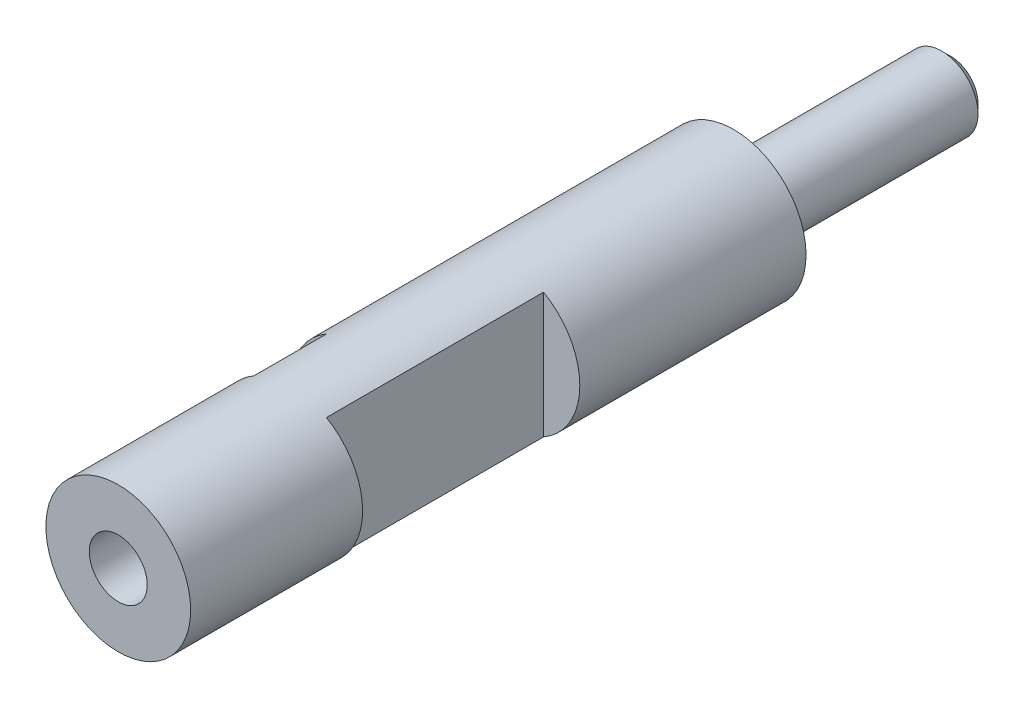
ISO-10303-21;
HEADER;
FILE_DESCRIPTION(('STEP AP214'),'2;1');
FILE_NAME('part.step','',(''),(''),'','','');
FILE_SCHEMA(('AUTOMOTIVE_DESIGN { 1 0 10303 214 1 1 1 1 }'));
ENDSEC;
DATA;
#1=APPLICATION_CONTEXT('core data for automotive mechanical design processes');
#2=APPLICATION_PROTOCOL_DEFINITION('international standard','automotive_design',2000,#1);
#3=PRODUCT_CONTEXT('',#1,'mechanical');
#4=PRODUCT('Part','Part','',(#3));
#5=PRODUCT_RELATED_PRODUCT_CATEGORY('part','',(#4));
#6=PRODUCT_DEFINITION_FORMATION('','',#4);
#7=PRODUCT_DEFINITION_CONTEXT('part definition',#1,'design');
#8=PRODUCT_DEFINITION('design','',#6,#7);
#9=PRODUCT_DEFINITION_SHAPE('','',#8);
#10=(LENGTH_UNIT() NAMED_UNIT(*) SI_UNIT(.MILLI.,.METRE.));
#11=(NAMED_UNIT(*) PLANE_ANGLE_UNIT() SI_UNIT($,.RADIAN.));
#12=(NAMED_UNIT(*) SI_UNIT($,.STERADIAN.) SOLID_ANGLE_UNIT());
#13=UNCERTAINTY_MEASURE_WITH_UNIT(LENGTH_MEASURE(1.E-05),#10,'distance_accuracy_value','');
#14=(GEOMETRIC_REPRESENTATION_CONTEXT(3) GLOBAL_UNCERTAINTY_ASSIGNED_CONTEXT((#13)) GLOBAL_UNIT_ASSIGNED_CONTEXT((#10,
#11,#12)) REPRESENTATION_CONTEXT('',''));
#15=CARTESIAN_POINT('',(0.,0.,0.));
#16=DIRECTION('',(0.,0.,1.));
#17=DIRECTION('',(1.,0.,0.));
#18=AXIS2_PLACEMENT_3D('',#15,#16,#17);
#19=CARTESIAN_POINT('',(0.,0.,12.));
#20=DIRECTION('',(0.,0.,-1.));
#21=DIRECTION('',(-1.,0.,0.));
#22=AXIS2_PLACEMENT_3D('',#19,#20,#21);
#23=CYLINDRICAL_SURFACE('',#22,2.);
#24=CARTESIAN_POINT('',(0.,0.,0.499999999999999));
#25=DIRECTION('',(0.,0.,1.));
#26=DIRECTION('',(1.,0.,0.));
#27=AXIS2_PLACEMENT_3D('',#24,#25,#26);
#28=CIRCLE('',#27,2.);
#29=CARTESIAN_POINT('',(2.,0.,0.499999999999999));
#30=VERTEX_POINT('',#29);
#31=EDGE_CURVE('E137',#30,#30,#28,.T.);
#32=ORIENTED_EDGE('',*,*,#31,.T.);
#33=EDGE_LOOP('',(#32));
#34=FACE_BOUND('',#33,.T.);
#35=CARTESIAN_POINT('',(0.,0.,12.));
#36=DIRECTION('',(0.,0.,1.));
#37=DIRECTION('',(1.,0.,0.));
#38=AXIS2_PLACEMENT_3D('',#35,#36,#37);
#39=CIRCLE('',#38,2.);
#40=CARTESIAN_POINT('',(2.,0.,12.));
#41=VERTEX_POINT('',#40);
#42=EDGE_CURVE('E141',#41,#41,#39,.T.);
#43=ORIENTED_EDGE('',*,*,#42,.F.);
#44=EDGE_LOOP('',(#43));
#45=FACE_BOUND('',#44,.T.);
#46=ADVANCED_FACE('F49',(#34,#45),#23,.T.);
#47=CARTESIAN_POINT('',(0.,0.,0.));
#48=DIRECTION('',(0.,0.,1.));
#49=DIRECTION('',(1.,0.,0.));
#50=AXIS2_PLACEMENT_3D('',#47,#48,#49);
#51=PLANE('',#50);
#52=CARTESIAN_POINT('',(0.,0.,0.));
#53=DIRECTION('',(0.,0.,1.));
#54=DIRECTION('',(1.,0.,0.));
#55=AXIS2_PLACEMENT_3D('',#52,#53,#54);
#56=CIRCLE('',#55,1.5);
#57=CARTESIAN_POINT('',(1.5,0.,0.));
#58=VERTEX_POINT('',#57);
#59=EDGE_CURVE('E133',#58,#58,#56,.F.);
#60=ORIENTED_EDGE('',*,*,#59,.T.);
#61=EDGE_LOOP('',(#60));
#62=FACE_BOUND('',#61,.T.);
#63=ADVANCED_FACE('F195',(#62),#51,.F.);
#64=CARTESIAN_POINT('',(0.,0.,0.499999999999999));
#65=DIRECTION('',(0.,0.,1.));
#66=DIRECTION('',(1.,0.,0.));
#67=AXIS2_PLACEMENT_3D('',#64,#65,#66);
#68=CONICAL_SURFACE('',#67,2.,0.78539816339745);
#69=ORIENTED_EDGE('',*,*,#59,.F.);
#70=EDGE_LOOP('',(#69));
#71=FACE_BOUND('',#70,.T.);
#72=ORIENTED_EDGE('',*,*,#31,.F.);
#73=EDGE_LOOP('',(#72));
#74=FACE_BOUND('',#73,.T.);
#75=ADVANCED_FACE('F52',(#71,#74),#68,.T.);
#76=CARTESIAN_POINT('',(0.,0.,46.));
#77=DIRECTION('',(0.,0.,-1.));
#78=DIRECTION('',(-1.,0.,0.));
#79=AXIS2_PLACEMENT_3D('',#76,#77,#78);
#80=CYLINDRICAL_SURFACE('',#79,4.);
#81=CARTESIAN_POINT('',(0.,0.,32.5));
#82=DIRECTION('',(0.,0.,-1.));
#83=DIRECTION('',(-1.,0.,0.));
#84=AXIS2_PLACEMENT_3D('',#81,#82,#83);
#85=CIRCLE('',#84,4.);
#86=CARTESIAN_POINT('',(-2.,-3.46410161513776,32.5));
#87=VERTEX_POINT('',#86);
#88=CARTESIAN_POINT('',(-2.,3.46410161513776,32.5));
#89=VERTEX_POINT('',#88);
#90=EDGE_CURVE('E11',#87,#89,#85,.T.);
#91=ORIENTED_EDGE('',*,*,#90,.T.);
#92=DIRECTION('',(0.,0.,-1.));
#93=VECTOR('',#92,1.);
#94=CARTESIAN_POINT('',(-2.,3.46410161513776,46.));
#95=LINE('',#94,#93);
#96=CARTESIAN_POINT('',(-2.,3.46410161513776,36.5));
#97=VERTEX_POINT('',#96);
#98=EDGE_CURVE('E101',#89,#97,#95,.F.);
#99=ORIENTED_EDGE('',*,*,#98,.T.);
#100=CARTESIAN_POINT('',(0.,0.,36.5));
#101=DIRECTION('',(0.,0.,1.));
#102=DIRECTION('',(1.,0.,0.));
#103=AXIS2_PLACEMENT_3D('',#100,#101,#102);
#104=CIRCLE('',#103,4.);
#105=CARTESIAN_POINT('',(-2.,-3.46410161513776,36.5));
#106=VERTEX_POINT('',#105);
#107=EDGE_CURVE('E95',#97,#106,#104,.T.);
#108=ORIENTED_EDGE('',*,*,#107,.T.);
#109=DIRECTION('',(0.,0.,-1.));
#110=VECTOR('',#109,1.);
#111=CARTESIAN_POINT('',(-2.,-3.46410161513776,46.));
#112=LINE('',#111,#110);
#113=EDGE_CURVE('E65',#106,#87,#112,.T.);
#114=ORIENTED_EDGE('',*,*,#113,.T.);
#115=EDGE_LOOP('',(#91,#99,#108,#114));
#116=FACE_BOUND('',#115,.T.);
#117=CARTESIAN_POINT('',(0.,0.,36.5));
#118=DIRECTION('',(0.,0.,1.));
#119=DIRECTION('',(1.,0.,0.));
#120=AXIS2_PLACEMENT_3D('',#117,#118,#119);
#121=CIRCLE('',#120,4.);
#122=CARTESIAN_POINT('',(2.,-3.46410161513775,36.5));
#123=VERTEX_POINT('',#122);
#124=CARTESIAN_POINT('',(2.,3.46410161513775,36.5));
#125=VERTEX_POINT('',#124);
#126=EDGE_CURVE('E102',#123,#125,#121,.T.);
#127=ORIENTED_EDGE('',*,*,#126,.T.);
#128=DIRECTION('',(0.,0.,-1.));
#129=VECTOR('',#128,1.);
#130=CARTESIAN_POINT('',(2.,3.46410161513775,46.));
#131=LINE('',#130,#129);
#132=CARTESIAN_POINT('',(2.,3.46410161513775,24.5));
#133=VERTEX_POINT('',#132);
#134=EDGE_CURVE('E121',#125,#133,#131,.T.);
#135=ORIENTED_EDGE('',*,*,#134,.T.);
#136=CARTESIAN_POINT('',(0.,0.,24.5));
#137=DIRECTION('',(0.,0.,-1.));
#138=DIRECTION('',(-1.,0.,0.));
#139=AXIS2_PLACEMENT_3D('',#136,#137,#138);
#140=CIRCLE('',#139,4.);
#141=CARTESIAN_POINT('',(2.,-3.46410161513775,24.5));
#142=VERTEX_POINT('',#141);
#143=EDGE_CURVE('E129',#133,#142,#140,.T.);
#144=ORIENTED_EDGE('',*,*,#143,.T.);
#145=DIRECTION('',(0.,0.,-1.));
#146=VECTOR('',#145,1.);
#147=CARTESIAN_POINT('',(2.,-3.46410161513775,46.));
#148=LINE('',#147,#146);
#149=EDGE_CURVE('E125',#142,#123,#148,.F.);
#150=ORIENTED_EDGE('',*,*,#149,.T.);
#151=EDGE_LOOP('',(#127,#135,#144,#150));
#152=FACE_BOUND('',#151,.T.);
#153=CARTESIAN_POINT('',(0.,0.,46.));
#154=DIRECTION('',(0.,0.,1.));
#155=DIRECTION('',(1.,0.,0.));
#156=AXIS2_PLACEMENT_3D('',#153,#154,#155);
#157=CIRCLE('',#156,4.);
#158=CARTESIAN_POINT('',(4.,0.,46.));
#159=VERTEX_POINT('',#158);
#160=EDGE_CURVE('E145',#159,#159,#157,.T.);
#161=ORIENTED_EDGE('',*,*,#160,.F.);
#162=EDGE_LOOP('',(#161));
#163=FACE_BOUND('',#162,.T.);
#164=CARTESIAN_POINT('',(0.,0.,12.));
#165=DIRECTION('',(0.,0.,1.));
#166=DIRECTION('',(1.,0.,0.));
#167=AXIS2_PLACEMENT_3D('',#164,#165,#166);
#168=CIRCLE('',#167,4.);
#169=CARTESIAN_POINT('',(4.,0.,12.));
#170=VERTEX_POINT('',#169);
#171=EDGE_CURVE('E146',#170,#170,#168,.T.);
#172=ORIENTED_EDGE('',*,*,#171,.T.);
#173=EDGE_LOOP('',(#172));
#174=FACE_BOUND('',#173,.T.);
#175=ADVANCED_FACE('F112',(#116,#152,#163,#174),#80,.T.);
#176=CARTESIAN_POINT('',(0.,0.,46.));
#177=DIRECTION('',(0.,0.,1.));
#178=DIRECTION('',(1.,0.,0.));
#179=AXIS2_PLACEMENT_3D('',#176,#177,#178);
#180=PLANE('',#179);
#181=CARTESIAN_POINT('',(0.,0.,46.));
#182=DIRECTION('',(0.,0.,1.));
#183=DIRECTION('',(1.,0.,0.));
#184=AXIS2_PLACEMENT_3D('',#181,#182,#183);
#185=CIRCLE('',#184,1.6);
#186=CARTESIAN_POINT('',(1.6,0.,46.));
#187=VERTEX_POINT('',#186);
#188=EDGE_CURVE('E154',#187,#187,#185,.T.);
#189=ORIENTED_EDGE('',*,*,#188,.F.);
#190=EDGE_LOOP('',(#189));
#191=FACE_BOUND('',#190,.T.);
#192=ORIENTED_EDGE('',*,*,#160,.T.);
#193=EDGE_LOOP('',(#192));
#194=FACE_BOUND('',#193,.T.);
#195=ADVANCED_FACE('F206',(#191,#194),#180,.T.);
#196=CARTESIAN_POINT('',(0.,0.,12.));
#197=DIRECTION('',(0.,0.,1.));
#198=DIRECTION('',(1.,0.,0.));
#199=AXIS2_PLACEMENT_3D('',#196,#197,#198);
#200=PLANE('',#199);
#201=ORIENTED_EDGE('',*,*,#42,.T.);
#202=EDGE_LOOP('',(#201));
#203=FACE_BOUND('',#202,.T.);
#204=ORIENTED_EDGE('',*,*,#171,.F.);
#205=EDGE_LOOP('',(#204));
#206=FACE_BOUND('',#205,.T.);
#207=ADVANCED_FACE('F207',(#203,#206),#200,.F.);
#208=CARTESIAN_POINT('',(0.,0.,32.));
#209=DIRECTION('',(0.,0.,1.));
#210=DIRECTION('',(1.,0.,0.));
#211=AXIS2_PLACEMENT_3D('',#208,#209,#210);
#212=CYLINDRICAL_SURFACE('',#211,1.6);
#213=CARTESIAN_POINT('',(-1.59992335562792,-0.01566065504026,35.8283589544012));
#214=CARTESIAN_POINT('',(-1.60051398641273,0.0446519743649532,35.8283592197506));
#215=CARTESIAN_POINT('',(-1.59766550649352,0.104997408818394,35.8239667157289));
#216=CARTESIAN_POINT('',(-1.58540080876899,0.223771259340163,35.8066823180663));
#217=CARTESIAN_POINT('',(-1.57598166030833,0.282198807810962,35.7937866319695));
#218=CARTESIAN_POINT('',(-1.55150084355407,0.395188253416264,35.760374184345));
#219=CARTESIAN_POINT('',(-1.53646918379697,0.449768905977262,35.7398979587068));
#220=CARTESIAN_POINT('',(-1.50190204246696,0.554372664157289,35.692301574983));
#221=CARTESIAN_POINT('',(-1.48236580191508,0.604394999759434,35.665180297221));
#222=CARTESIAN_POINT('',(-1.43807942581234,0.703665469680316,35.6024812798065));
#223=CARTESIAN_POINT('',(-1.41301610681427,0.752425931415431,35.5663575336208));
#224=CARTESIAN_POINT('',(-1.36056048199697,0.843591900012313,35.488192646947));
#225=CARTESIAN_POINT('',(-1.33316510016127,0.885988803170326,35.4461436415567));
#226=CARTESIAN_POINT('',(-1.27171375826338,0.972696519746002,35.3470471335981));
#227=CARTESIAN_POINT('',(-1.23749837307348,1.01543918038734,35.2887224688972));
#228=CARTESIAN_POINT('',(-1.17162156081411,1.09077571150146,35.1645057536111));
#229=CARTESIAN_POINT('',(-1.13995771784218,1.12337926776434,35.0986210079993));
#230=CARTESIAN_POINT('',(-1.09394875080726,1.1678719777496,34.9834799618983));
#231=CARTESIAN_POINT('',(-1.07740482521582,1.1830240111865,34.936375327916));
#232=CARTESIAN_POINT('',(-1.04953046256598,1.20782233997995,34.8392964223545));
#233=CARTESIAN_POINT('',(-1.03818785945617,1.2174814961937,34.7893291579999));
#234=CARTESIAN_POINT('',(-1.02249254412877,1.23070078602073,34.6868602910238));
#235=CARTESIAN_POINT('',(-1.01821983671318,1.23419114157047,34.6343365141266));
#236=CARTESIAN_POINT('',(-1.0178724951523,1.23447813883338,34.5292405314093));
#237=CARTESIAN_POINT('',(-1.02179716412174,1.23127534955226,34.4766683300855));
#238=CARTESIAN_POINT('',(-1.03593474676385,1.21938658790336,34.3803761031151));
#239=CARTESIAN_POINT('',(-1.04523727013323,1.21149053358207,34.3364119485059));
#240=CARTESIAN_POINT('',(-1.0680682721456,1.19141181547486,34.2506085122644));
#241=CARTESIAN_POINT('',(-1.08160163062656,1.17922419974784,34.2087717494777));
#242=CARTESIAN_POINT('',(-1.12134512401767,1.14180898464298,34.1010579231685));
#243=CARTESIAN_POINT('',(-1.15007117945429,1.1132581721954,34.0372685320052));
#244=CARTESIAN_POINT('',(-1.21079911095485,1.0469018998542,33.916366081359));
#245=CARTESIAN_POINT('',(-1.24280918524454,1.00907293405578,33.8592705321949));
#246=CARTESIAN_POINT('',(-1.30792562906444,0.92321984880614,33.7501191331051));
#247=CARTESIAN_POINT('',(-1.34103226652577,0.874892807051372,33.6983006557326));
#248=CARTESIAN_POINT('',(-1.40433331125403,0.769177712321846,33.6028682066918));
#249=CARTESIAN_POINT('',(-1.43453279318054,0.711805927139406,33.5592398072826));
#250=CARTESIAN_POINT('',(-1.48443376961649,0.599598449367478,33.4886249824086));
#251=CARTESIAN_POINT('',(-1.50504634687406,0.546169472223825,33.4600563389661));
#252=CARTESIAN_POINT('',(-1.54106786576418,0.434232594377977,33.4105260058673));
#253=CARTESIAN_POINT('',(-1.55647968280805,0.375727522730022,33.389560112301));
#254=CARTESIAN_POINT('',(-1.58084638241591,0.254498852970564,33.3562752203533));
#255=CARTESIAN_POINT('',(-1.58975375700925,0.191747803694553,33.3440198600465));
#256=CARTESIAN_POINT('',(-1.59996947812143,0.0645053856165514,33.3292929431087));
#257=CARTESIAN_POINT('',(-1.60128288424633,1.52043270332719E-05,33.3268148725476));
#258=CARTESIAN_POINT('',(-1.59645235525257,-0.120616556582351,33.3314865657478));
#259=CARTESIAN_POINT('',(-1.59117410203303,-0.176841440544743,33.3375296846597));
#260=CARTESIAN_POINT('',(-1.57500505300092,-0.287173169729356,33.356917624019));
#261=CARTESIAN_POINT('',(-1.56411335127823,-0.3412796715657,33.3702636230419));
#262=CARTESIAN_POINT('',(-1.53729548909393,-0.446923327601417,33.4037812300448));
#263=CARTESIAN_POINT('',(-1.52129649588839,-0.498409975418251,33.4240519006189));
#264=CARTESIAN_POINT('',(-1.48533008941169,-0.597124861083465,33.470487948946));
#265=CARTESIAN_POINT('',(-1.46536195190852,-0.644352319487041,33.4966544025926));
#266=CARTESIAN_POINT('',(-1.41902464365573,-0.74142502600735,33.5587485978625));
#267=CARTESIAN_POINT('',(-1.3921425790386,-0.790449978368748,33.595571450904));
#268=CARTESIAN_POINT('',(-1.33605044002321,-0.881962312254924,33.6751930082608));
#269=CARTESIAN_POINT('',(-1.30683650988296,-0.92443851070811,33.7180017018434));
#270=CARTESIAN_POINT('',(-1.24140710430547,-1.01116593234711,33.8188769753201));
#271=CARTESIAN_POINT('',(-1.20504692611013,-1.05380517512688,33.8782392950905));
#272=CARTESIAN_POINT('',(-1.13518283042602,-1.12869906068295,34.0047392236078));
#273=CARTESIAN_POINT('',(-1.10167504338259,-1.16096794242203,34.0718659975897));
#274=CARTESIAN_POINT('',(-1.05444112936122,-1.20364167444238,34.1867291285406));
#275=CARTESIAN_POINT('',(-1.03806068875805,-1.21768362131629,34.2320081938132));
#276=CARTESIAN_POINT('',(-1.0104203157203,-1.24071536408044,34.3252983445065));
#277=CARTESIAN_POINT('',(-0.999148237778241,-1.2497171554502,34.3733026411409));
#278=CARTESIAN_POINT('',(-0.983463102167712,-1.26210538745594,34.4717844666174));
#279=CARTESIAN_POINT('',(-0.979131367141739,-1.26542528142483,34.5222842714969));
#280=CARTESIAN_POINT('',(-0.978555168224698,-1.26587150660356,34.6233606962954));
#281=CARTESIAN_POINT('',(-0.982309836887773,-1.26299850213887,34.6739373073936));
#282=CARTESIAN_POINT('',(-0.996061571394137,-1.25216566064754,34.7666219007126));
#283=CARTESIAN_POINT('',(-1.00516089684863,-1.24493406982141,34.808960812758));
#284=CARTESIAN_POINT('',(-1.02755933198251,-1.2265125680985,34.8916214072142));
#285=CARTESIAN_POINT('',(-1.04086345229758,-1.21531793272578,34.9319406160963));
#286=CARTESIAN_POINT('',(-1.08067995517945,-1.18035096506175,35.0376091942421));
#287=CARTESIAN_POINT('',(-1.10993503032938,-1.15325054881688,35.1008159545432));
#288=CARTESIAN_POINT('',(-1.17200823137658,-1.09012526172874,35.2207259558639));
#289=CARTESIAN_POINT('',(-1.20483578592623,-1.05407643651562,35.2774111330086));
#290=CARTESIAN_POINT('',(-1.27218138116026,-0.971853214978283,35.3864712768895));
#291=CARTESIAN_POINT('',(-1.30671283592181,-0.925319296592899,35.4385679757748));
#292=CARTESIAN_POINT('',(-1.37325710705258,-0.823326215813891,35.5349596697424));
#293=CARTESIAN_POINT('',(-1.40527389407412,-0.767881563111055,35.57926710687));
#294=CARTESIAN_POINT('',(-1.45960439498907,-0.657804899215236,35.6525109937778));
#295=CARTESIAN_POINT('',(-1.48265211098081,-0.604420943860361,35.6827693297716));
#296=CARTESIAN_POINT('',(-1.5235992884539,-0.492143025567972,35.7356422123316));
#297=CARTESIAN_POINT('',(-1.54150275479068,-0.433253396459097,35.7582627074576));
#298=CARTESIAN_POINT('',(-1.56969474706029,-0.315391338701414,35.793338615078));
#299=CARTESIAN_POINT('',(-1.5804220662934,-0.256702770288071,35.806385806492));
#300=CARTESIAN_POINT('',(-1.59523677788673,-0.137240009122235,35.8238934371142));
#301=CARTESIAN_POINT('',(-1.59932788993347,-0.0764670042469674,35.8283586868797));
#302=CARTESIAN_POINT('',(-1.59992335562792,-0.01566065504026,35.8283589544012));
#303=B_SPLINE_CURVE_WITH_KNOTS('',3,(#213,#214,#215,#216,#217,#218,#219,#220,#221,#222,#223,
#224,#225,#226,#227,#228,#229,#230,#231,#232,#233,#234,#235,#236,#237,#238,#239,#240,#241,#242,
#243,#244,#245,#246,#247,#248,#249,#250,#251,#252,#253,#254,#255,#256,#257,#258,#259,#260,#261,
#262,#263,#264,#265,#266,#267,#268,#269,#270,#271,#272,#273,#274,#275,#276,#277,#278,#279,#280,
#281,#282,#283,#284,#285,#286,#287,#288,#289,#290,#291,#292,#293,#294,#295,#296,#297,#298,#299,
#300,#301,#302),.UNSPECIFIED.,.T.,.F.,(4,2,2,2,2,2,2,2,2,2,2,2,2,2,2,2,2,2,2,2,2,2,2,2,2,2,2,2,
2,2,2,2,2,2,2,2,2,2,2,2,2,2,2,2,4),(0.,0.180697664804613,0.361475976113659,0.541301243803317,
0.721156832507399,0.917433550919698,1.11397329556707,1.35300739255978,1.59181243607709,
1.74784560977227,1.90351193180966,2.0609280600016,2.21833080628809,2.35469962106323,
2.49122630733711,2.71666526199695,2.94268136805058,3.17638253655457,3.40966806949399,
3.60090602888267,3.79203808217807,3.98455255568754,4.17693874847701,4.34651559710191,
4.51611982096846,4.68825969671778,4.86043101094089,5.06056104031514,5.26102912692568,
5.50496266100496,5.74855981825055,5.89857806565769,6.04823773792538,6.19963853243931,
6.35102308667446,6.48225080894902,6.61363550186634,6.83660036682413,7.06016865692379,
7.29305882420956,7.52557353977493,7.72145779248962,7.91718913137501,8.09946819441388,
8.28164505215168),.UNSPECIFIED.);
#304=CARTESIAN_POINT('',(-1.59992335562792,-0.01566065504026,35.8283589544012));
#305=VERTEX_POINT('',#304);
#306=EDGE_CURVE('E54',#305,#305,#303,.T.);
#307=ORIENTED_EDGE('',*,*,#306,.T.);
#308=EDGE_LOOP('',(#307));
#309=FACE_BOUND('',#308,.T.);
#310=CARTESIAN_POINT('',(0.,0.,32.));
#311=DIRECTION('',(0.,0.,1.));
#312=DIRECTION('',(1.,0.,0.));
#313=AXIS2_PLACEMENT_3D('',#310,#311,#312);
#314=CIRCLE('',#313,1.6);
#315=CARTESIAN_POINT('',(1.6,0.,32.));
#316=VERTEX_POINT('',#315);
#317=EDGE_CURVE('E150',#316,#316,#314,.T.);
#318=ORIENTED_EDGE('',*,*,#317,.F.);
#319=EDGE_LOOP('',(#318));
#320=FACE_BOUND('',#319,.T.);
#321=ORIENTED_EDGE('',*,*,#188,.T.);
#322=EDGE_LOOP('',(#321));
#323=FACE_BOUND('',#322,.T.);
#324=ADVANCED_FACE('F210',(#309,#320,#323),#212,.F.);
#325=CARTESIAN_POINT('',(0.,0.,32.));
#326=DIRECTION('',(0.,0.,1.));
#327=DIRECTION('',(1.,0.,0.));
#328=AXIS2_PLACEMENT_3D('',#325,#326,#327);
#329=PLANE('',#328);
#330=CARTESIAN_POINT('',(0.,0.,32.));
#331=VERTEX_POINT('',#330);
#332=VERTEX_LOOP('',#331);
#333=FACE_BOUND('',#332,.T.);
#334=ORIENTED_EDGE('',*,*,#317,.T.);
#335=EDGE_LOOP('',(#334));
#336=FACE_BOUND('',#335,.T.);
#337=ADVANCED_FACE('F217',(#333,#336),#329,.T.);
#338=CARTESIAN_POINT('',(4.,-4.,36.5));
#339=DIRECTION('',(0.,0.,1.));
#340=DIRECTION('',(1.,0.,0.));
#341=AXIS2_PLACEMENT_3D('',#338,#339,#340);
#342=PLANE('',#341);
#343=ORIENTED_EDGE('',*,*,#126,.F.);
#344=DIRECTION('',(0.,1.,0.));
#345=VECTOR('',#344,1.);
#346=CARTESIAN_POINT('',(2.,-4.,36.5));
#347=LINE('',#346,#345);
#348=EDGE_CURVE('E158',#123,#125,#347,.T.);
#349=ORIENTED_EDGE('',*,*,#348,.T.);
#350=EDGE_LOOP('',(#343,#349));
#351=FACE_BOUND('',#350,.T.);
#352=ADVANCED_FACE('F221',(#351),#342,.F.);
#353=CARTESIAN_POINT('',(2.,-4.,24.5));
#354=DIRECTION('',(-1.,0.,0.));
#355=DIRECTION('',(0.,0.,1.));
#356=AXIS2_PLACEMENT_3D('',#353,#354,#355);
#357=PLANE('',#356);
#358=ORIENTED_EDGE('',*,*,#348,.F.);
#359=ORIENTED_EDGE('',*,*,#149,.F.);
#360=DIRECTION('',(0.,1.,0.));
#361=VECTOR('',#360,1.);
#362=CARTESIAN_POINT('',(2.,-4.,24.5));
#363=LINE('',#362,#361);
#364=EDGE_CURVE('E162',#142,#133,#363,.T.);
#365=ORIENTED_EDGE('',*,*,#364,.T.);
#366=ORIENTED_EDGE('',*,*,#134,.F.);
#367=EDGE_LOOP('',(#358,#359,#365,#366));
#368=FACE_BOUND('',#367,.T.);
#369=ADVANCED_FACE('F224',(#368),#357,.F.);
#370=CARTESIAN_POINT('',(4.,-4.,24.5));
#371=DIRECTION('',(0.,0.,-1.));
#372=DIRECTION('',(-1.,0.,0.));
#373=AXIS2_PLACEMENT_3D('',#370,#371,#372);
#374=PLANE('',#373);
#375=ORIENTED_EDGE('',*,*,#364,.F.);
#376=ORIENTED_EDGE('',*,*,#143,.F.);
#377=EDGE_LOOP('',(#375,#376));
#378=FACE_BOUND('',#377,.T.);
#379=ADVANCED_FACE('F191',(#378),#374,.F.);
#380=CARTESIAN_POINT('',(-4.,-4.,32.5));
#381=DIRECTION('',(0.,0.,-1.));
#382=DIRECTION('',(-1.,0.,0.));
#383=AXIS2_PLACEMENT_3D('',#380,#381,#382);
#384=PLANE('',#383);
#385=ORIENTED_EDGE('',*,*,#90,.F.);
#386=DIRECTION('',(0.,1.,0.));
#387=VECTOR('',#386,1.);
#388=CARTESIAN_POINT('',(-2.,-4.,32.5));
#389=LINE('',#388,#387);
#390=EDGE_CURVE('E110',#87,#89,#389,.T.);
#391=ORIENTED_EDGE('',*,*,#390,.T.);
#392=EDGE_LOOP('',(#385,#391));
#393=FACE_BOUND('',#392,.T.);
#394=ADVANCED_FACE('F183',(#393),#384,.F.);
#395=CARTESIAN_POINT('',(-2.,-4.,32.5));
#396=DIRECTION('',(1.,0.,0.));
#397=DIRECTION('',(0.,0.,-1.));
#398=AXIS2_PLACEMENT_3D('',#395,#396,#397);
#399=PLANE('',#398);
#400=CARTESIAN_POINT('',(-2.,-0.01566065504026,34.5783589544012));
#401=DIRECTION('',(-1.,0.,0.));
#402=DIRECTION('',(0.,0.,1.));
#403=AXIS2_PLACEMENT_3D('',#400,#401,#402);
#404=CIRCLE('',#403,1.525);
#405=CARTESIAN_POINT('',(-2.,-0.01566065504026,36.1033589544012));
#406=VERTEX_POINT('',#405);
#407=EDGE_CURVE('E175',#406,#406,#404,.T.);
#408=ORIENTED_EDGE('',*,*,#407,.F.);
#409=EDGE_LOOP('',(#408));
#410=FACE_BOUND('',#409,.T.);
#411=DIRECTION('',(0.,1.,0.));
#412=VECTOR('',#411,1.);
#413=CARTESIAN_POINT('',(-2.,-4.,36.5));
#414=LINE('',#413,#412);
#415=EDGE_CURVE('E71',#106,#97,#414,.T.);
#416=ORIENTED_EDGE('',*,*,#415,.T.);
#417=ORIENTED_EDGE('',*,*,#98,.F.);
#418=ORIENTED_EDGE('',*,*,#390,.F.);
#419=ORIENTED_EDGE('',*,*,#113,.F.);
#420=EDGE_LOOP('',(#416,#417,#418,#419));
#421=FACE_BOUND('',#420,.T.);
#422=ADVANCED_FACE('F106',(#410,#421),#399,.F.);
#423=CARTESIAN_POINT('',(-4.,-4.,36.5));
#424=DIRECTION('',(0.,0.,1.));
#425=DIRECTION('',(1.,0.,0.));
#426=AXIS2_PLACEMENT_3D('',#423,#424,#425);
#427=PLANE('',#426);
#428=ORIENTED_EDGE('',*,*,#415,.F.);
#429=ORIENTED_EDGE('',*,*,#107,.F.);
#430=EDGE_LOOP('',(#428,#429));
#431=FACE_BOUND('',#430,.T.);
#432=ADVANCED_FACE('F96',(#431),#427,.F.);
#433=CARTESIAN_POINT('',(-2.,-0.01566065504026,34.5783589544012));
#434=DIRECTION('',(-1.,0.,0.));
#435=DIRECTION('',(0.,0.,1.));
#436=AXIS2_PLACEMENT_3D('',#433,#434,#435);
#437=CYLINDRICAL_SURFACE('',#436,1.24999999999999);
#438=CARTESIAN_POINT('',(-1.725,-0.01566065504026,34.5783589544012));
#439=DIRECTION('',(-1.,0.,0.));
#440=DIRECTION('',(0.,0.,1.));
#441=AXIS2_PLACEMENT_3D('',#438,#439,#440);
#442=CIRCLE('',#441,1.24999999999999);
#443=CARTESIAN_POINT('',(-1.725,-0.01566065504026,35.8283589544012));
#444=VERTEX_POINT('',#443);
#445=EDGE_CURVE('E171',#444,#444,#442,.T.);
#446=ORIENTED_EDGE('',*,*,#445,.T.);
#447=EDGE_LOOP('',(#446));
#448=FACE_BOUND('',#447,.T.);
#449=ORIENTED_EDGE('',*,*,#306,.F.);
#450=EDGE_LOOP('',(#449));
#451=FACE_BOUND('',#450,.T.);
#452=ADVANCED_FACE('F189',(#448,#451),#437,.F.);
#453=CARTESIAN_POINT('',(-2.,-0.01566065504026,34.5783589544012));
#454=DIRECTION('',(-1.,0.,0.));
#455=DIRECTION('',(0.,0.,1.));
#456=AXIS2_PLACEMENT_3D('',#453,#454,#455);
#457=CONICAL_SURFACE('',#456,1.525,0.78539816339747);
#458=ORIENTED_EDGE('',*,*,#445,.F.);
#459=EDGE_LOOP('',(#458));
#460=FACE_BOUND('',#459,.T.);
#461=ORIENTED_EDGE('',*,*,#407,.T.);
#462=EDGE_LOOP('',(#461));
#463=FACE_BOUND('',#462,.T.);
#464=ADVANCED_FACE('F180',(#460,#463),#457,.F.);
#465=CLOSED_SHELL('',(#46,#63,#75,#175,#195,#207,#324,#337,#352,#369,#379,#394,#422,#432,#452,#464));
#466=MANIFOLD_SOLID_BREP('B2',#465);
#467=ADVANCED_BREP_SHAPE_REPRESENTATION('',(#18,#466),#14);
#468=SHAPE_DEFINITION_REPRESENTATION(#9,#467);
ENDSEC;
END-ISO-10303-21;
